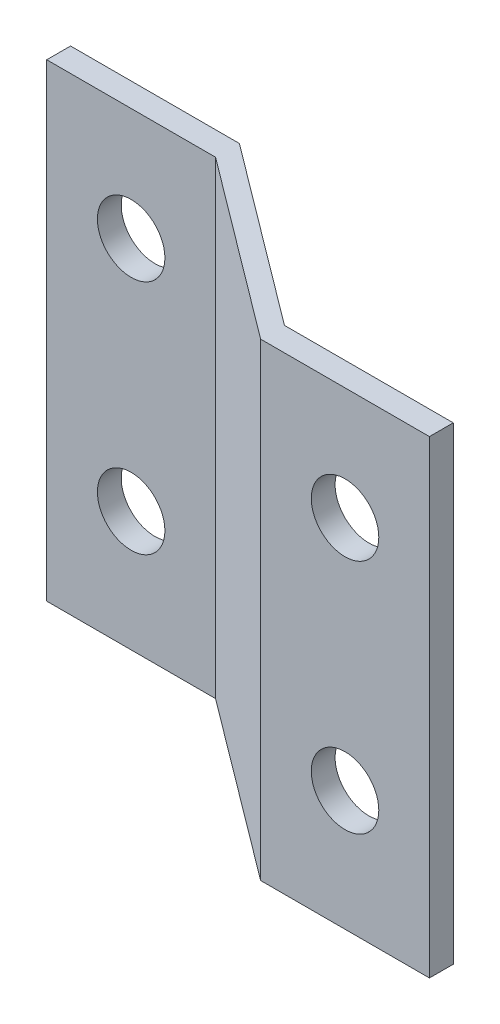
ISO-10303-21;
HEADER;
FILE_DESCRIPTION(('STEP AP214'),'2;1');
FILE_NAME('part.step','',(''),(''),'','','');
FILE_SCHEMA(('AUTOMOTIVE_DESIGN { 1 0 10303 214 1 1 1 1 }'));
ENDSEC;
DATA;
#1=APPLICATION_CONTEXT('core data for automotive mechanical design processes');
#2=APPLICATION_PROTOCOL_DEFINITION('international standard','automotive_design',2000,#1);
#3=PRODUCT_CONTEXT('',#1,'mechanical');
#4=PRODUCT('Part','Part','',(#3));
#5=PRODUCT_RELATED_PRODUCT_CATEGORY('part','',(#4));
#6=PRODUCT_DEFINITION_FORMATION('','',#4);
#7=PRODUCT_DEFINITION_CONTEXT('part definition',#1,'design');
#8=PRODUCT_DEFINITION('design','',#6,#7);
#9=PRODUCT_DEFINITION_SHAPE('','',#8);
#10=(LENGTH_UNIT() NAMED_UNIT(*) SI_UNIT(.MILLI.,.METRE.));
#11=(NAMED_UNIT(*) PLANE_ANGLE_UNIT() SI_UNIT($,.RADIAN.));
#12=(NAMED_UNIT(*) SI_UNIT($,.STERADIAN.) SOLID_ANGLE_UNIT());
#13=UNCERTAINTY_MEASURE_WITH_UNIT(LENGTH_MEASURE(1.E-05),#10,'distance_accuracy_value','');
#14=(GEOMETRIC_REPRESENTATION_CONTEXT(3) GLOBAL_UNCERTAINTY_ASSIGNED_CONTEXT((#13)) GLOBAL_UNIT_ASSIGNED_CONTEXT((#10,
#11,#12)) REPRESENTATION_CONTEXT('',''));
#15=CARTESIAN_POINT('',(0.,0.,0.));
#16=DIRECTION('',(0.,0.,1.));
#17=DIRECTION('',(1.,0.,0.));
#18=AXIS2_PLACEMENT_3D('',#15,#16,#17);
#19=CARTESIAN_POINT('',(-33.2847260877516,125.,-35.9879923557688));
#20=DIRECTION('',(0.,0.,1.));
#21=DIRECTION('',(1.,0.,0.));
#22=AXIS2_PLACEMENT_3D('',#19,#20,#21);
#23=PLANE('',#22);
#24=CARTESIAN_POINT('',(-55.7847260877516,95.,-35.9879923557688));
#25=DIRECTION('',(0.,0.,1.));
#26=DIRECTION('',(1.,0.,0.));
#27=AXIS2_PLACEMENT_3D('',#24,#25,#26);
#28=CIRCLE('',#27,9.00000000000002);
#29=CARTESIAN_POINT('',(-46.7847260877516,95.,-35.9879923557688));
#30=VERTEX_POINT('',#29);
#31=EDGE_CURVE('E153',#30,#30,#28,.T.);
#32=ORIENTED_EDGE('',*,*,#31,.T.);
#33=EDGE_LOOP('',(#32));
#34=FACE_BOUND('',#33,.T.);
#35=CARTESIAN_POINT('',(-55.7847260877516,32.,-35.9879923557688));
#36=DIRECTION('',(0.,0.,1.));
#37=DIRECTION('',(1.,0.,0.));
#38=AXIS2_PLACEMENT_3D('',#35,#36,#37);
#39=CIRCLE('',#38,9.);
#40=CARTESIAN_POINT('',(-46.7847260877516,32.,-35.9879923557688));
#41=VERTEX_POINT('',#40);
#42=EDGE_CURVE('E197',#41,#41,#39,.T.);
#43=ORIENTED_EDGE('',*,*,#42,.T.);
#44=EDGE_LOOP('',(#43));
#45=FACE_BOUND('',#44,.T.);
#46=DIRECTION('',(-1.,0.,0.));
#47=VECTOR('',#46,1.);
#48=CARTESIAN_POINT('',(-33.2847260877516,0.,-35.9879923557688));
#49=LINE('',#48,#47);
#50=CARTESIAN_POINT('',(-33.2847260877516,0.,-35.9879923557688));
#51=VERTEX_POINT('',#50);
#52=CARTESIAN_POINT('',(-78.2847260877516,0.,-35.9879923557688));
#53=VERTEX_POINT('',#52);
#54=EDGE_CURVE('E148',#51,#53,#49,.T.);
#55=ORIENTED_EDGE('',*,*,#54,.T.);
#56=DIRECTION('',(0.,-1.,0.));
#57=VECTOR('',#56,1.);
#58=CARTESIAN_POINT('',(-78.2847260877516,125.,-35.9879923557688));
#59=LINE('',#58,#57);
#60=CARTESIAN_POINT('',(-78.2847260877516,125.,-35.9879923557688));
#61=VERTEX_POINT('',#60);
#62=EDGE_CURVE('E11',#61,#53,#59,.T.);
#63=ORIENTED_EDGE('',*,*,#62,.F.);
#64=DIRECTION('',(-1.,0.,0.));
#65=VECTOR('',#64,1.);
#66=CARTESIAN_POINT('',(-33.2847260877516,125.,-35.9879923557688));
#67=LINE('',#66,#65);
#68=CARTESIAN_POINT('',(-33.2847260877516,125.,-35.9879923557688));
#69=VERTEX_POINT('',#68);
#70=EDGE_CURVE('E171',#69,#61,#67,.T.);
#71=ORIENTED_EDGE('',*,*,#70,.F.);
#72=DIRECTION('',(0.,-1.,0.));
#73=VECTOR('',#72,1.);
#74=CARTESIAN_POINT('',(-33.2847260877516,125.,-35.9879923557688));
#75=LINE('',#74,#73);
#76=EDGE_CURVE('E144',#69,#51,#75,.T.);
#77=ORIENTED_EDGE('',*,*,#76,.T.);
#78=EDGE_LOOP('',(#55,#63,#71,#77));
#79=FACE_BOUND('',#78,.T.);
#80=ADVANCED_FACE('F45',(#34,#45,#79),#23,.F.);
#81=CARTESIAN_POINT('',(-78.2847260877516,125.,-35.9879923557688));
#82=DIRECTION('',(1.,0.,0.));
#83=DIRECTION('',(0.,0.,-1.));
#84=AXIS2_PLACEMENT_3D('',#81,#82,#83);
#85=PLANE('',#84);
#86=DIRECTION('',(0.,0.,1.));
#87=VECTOR('',#86,1.);
#88=CARTESIAN_POINT('',(-78.2847260877516,0.,-35.9879923557688));
#89=LINE('',#88,#87);
#90=CARTESIAN_POINT('',(-78.2847260877516,0.,-29.6379923557688));
#91=VERTEX_POINT('',#90);
#92=EDGE_CURVE('E152',#53,#91,#89,.T.);
#93=ORIENTED_EDGE('',*,*,#92,.T.);
#94=DIRECTION('',(0.,-1.,0.));
#95=VECTOR('',#94,1.);
#96=CARTESIAN_POINT('',(-78.2847260877516,125.,-29.6379923557688));
#97=LINE('',#96,#95);
#98=CARTESIAN_POINT('',(-78.2847260877516,125.,-29.6379923557688));
#99=VERTEX_POINT('',#98);
#100=EDGE_CURVE('E55',#99,#91,#97,.T.);
#101=ORIENTED_EDGE('',*,*,#100,.F.);
#102=DIRECTION('',(0.,0.,1.));
#103=VECTOR('',#102,1.);
#104=CARTESIAN_POINT('',(-78.2847260877516,125.,-35.9879923557688));
#105=LINE('',#104,#103);
#106=EDGE_CURVE('E107',#61,#99,#105,.T.);
#107=ORIENTED_EDGE('',*,*,#106,.F.);
#108=ORIENTED_EDGE('',*,*,#62,.T.);
#109=EDGE_LOOP('',(#93,#101,#107,#108));
#110=FACE_BOUND('',#109,.T.);
#111=ADVANCED_FACE('F261',(#110),#85,.F.);
#112=CARTESIAN_POINT('',(-78.2847260877516,125.,-29.6379923557688));
#113=DIRECTION('',(0.,0.,-1.));
#114=DIRECTION('',(-1.,0.,0.));
#115=AXIS2_PLACEMENT_3D('',#112,#113,#114);
#116=PLANE('',#115);
#117=CARTESIAN_POINT('',(-55.7847260877516,95.,-29.6379923557688));
#118=DIRECTION('',(0.,0.,1.));
#119=DIRECTION('',(1.,0.,0.));
#120=AXIS2_PLACEMENT_3D('',#117,#118,#119);
#121=CIRCLE('',#120,9.00000000000002);
#122=CARTESIAN_POINT('',(-46.7847260877516,95.,-29.6379923557688));
#123=VERTEX_POINT('',#122);
#124=EDGE_CURVE('E210',#123,#123,#121,.T.);
#125=ORIENTED_EDGE('',*,*,#124,.F.);
#126=EDGE_LOOP('',(#125));
#127=FACE_BOUND('',#126,.T.);
#128=CARTESIAN_POINT('',(-55.7847260877516,32.,-29.6379923557688));
#129=DIRECTION('',(0.,0.,1.));
#130=DIRECTION('',(1.,0.,0.));
#131=AXIS2_PLACEMENT_3D('',#128,#129,#130);
#132=CIRCLE('',#131,9.);
#133=CARTESIAN_POINT('',(-46.7847260877516,32.,-29.6379923557688));
#134=VERTEX_POINT('',#133);
#135=EDGE_CURVE('E214',#134,#134,#132,.T.);
#136=ORIENTED_EDGE('',*,*,#135,.F.);
#137=EDGE_LOOP('',(#136));
#138=FACE_BOUND('',#137,.T.);
#139=DIRECTION('',(1.,0.,0.));
#140=VECTOR('',#139,1.);
#141=CARTESIAN_POINT('',(-78.2847260877516,0.,-29.6379923557688));
#142=LINE('',#141,#140);
#143=CARTESIAN_POINT('',(-33.2847260877516,0.,-29.6379923557688));
#144=VERTEX_POINT('',#143);
#145=EDGE_CURVE('E156',#91,#144,#142,.T.);
#146=ORIENTED_EDGE('',*,*,#145,.T.);
#147=DIRECTION('',(0.,-1.,0.));
#148=VECTOR('',#147,1.);
#149=CARTESIAN_POINT('',(-33.2847260877516,125.,-29.6379923557688));
#150=LINE('',#149,#148);
#151=CARTESIAN_POINT('',(-33.2847260877516,125.,-29.6379923557688));
#152=VERTEX_POINT('',#151);
#153=EDGE_CURVE('E182',#152,#144,#150,.T.);
#154=ORIENTED_EDGE('',*,*,#153,.F.);
#155=DIRECTION('',(1.,0.,0.));
#156=VECTOR('',#155,1.);
#157=CARTESIAN_POINT('',(-78.2847260877516,125.,-29.6379923557688));
#158=LINE('',#157,#156);
#159=EDGE_CURVE('E225',#99,#152,#158,.T.);
#160=ORIENTED_EDGE('',*,*,#159,.F.);
#161=ORIENTED_EDGE('',*,*,#100,.T.);
#162=EDGE_LOOP('',(#146,#154,#160,#161));
#163=FACE_BOUND('',#162,.T.);
#164=ADVANCED_FACE('F268',(#127,#138,#163),#116,.F.);
#165=CARTESIAN_POINT('',(-33.2847260877516,125.,-29.6379923557688));
#166=DIRECTION('',(0.599799872596146,0.,-0.800150056447943));
#167=DIRECTION('',(-0.800150056447943,0.,-0.599799872596146));
#168=AXIS2_PLACEMENT_3D('',#165,#166,#167);
#169=PLANE('',#168);
#170=DIRECTION('',(0.800150056447943,0.,0.599799872596146));
#171=VECTOR('',#170,1.);
#172=CARTESIAN_POINT('',(-33.2847260877516,0.,-29.6379923557688));
#173=LINE('',#172,#171);
#174=CARTESIAN_POINT('',(14.724277299125,0.,6.34999999999998));
#175=VERTEX_POINT('',#174);
#176=EDGE_CURVE('E159',#144,#175,#173,.T.);
#177=ORIENTED_EDGE('',*,*,#176,.T.);
#178=DIRECTION('',(0.,-1.,0.));
#179=VECTOR('',#178,1.);
#180=CARTESIAN_POINT('',(14.724277299125,125.,6.34999999999998));
#181=LINE('',#180,#179);
#182=CARTESIAN_POINT('',(14.724277299125,125.,6.34999999999998));
#183=VERTEX_POINT('',#182);
#184=EDGE_CURVE('E178',#183,#175,#181,.T.);
#185=ORIENTED_EDGE('',*,*,#184,.F.);
#186=DIRECTION('',(0.800150056447943,0.,0.599799872596146));
#187=VECTOR('',#186,1.);
#188=CARTESIAN_POINT('',(-33.2847260877516,125.,-29.6379923557688));
#189=LINE('',#188,#187);
#190=EDGE_CURVE('E228',#152,#183,#189,.T.);
#191=ORIENTED_EDGE('',*,*,#190,.F.);
#192=ORIENTED_EDGE('',*,*,#153,.T.);
#193=EDGE_LOOP('',(#177,#185,#191,#192));
#194=FACE_BOUND('',#193,.T.);
#195=ADVANCED_FACE('F236',(#194),#169,.F.);
#196=CARTESIAN_POINT('',(14.724277299125,125.,6.34999999999998));
#197=DIRECTION('',(0.,0.,-1.));
#198=DIRECTION('',(-1.,0.,0.));
#199=AXIS2_PLACEMENT_3D('',#196,#197,#198);
#200=PLANE('',#199);
#201=CARTESIAN_POINT('',(37.224277299125,95.,6.34999999999999));
#202=DIRECTION('',(0.,0.,1.));
#203=DIRECTION('',(1.,0.,0.));
#204=AXIS2_PLACEMENT_3D('',#201,#202,#203);
#205=CIRCLE('',#204,9.00000000000001);
#206=CARTESIAN_POINT('',(46.224277299125,95.,6.34999999999999));
#207=VERTEX_POINT('',#206);
#208=EDGE_CURVE('E191',#207,#207,#205,.T.);
#209=ORIENTED_EDGE('',*,*,#208,.F.);
#210=EDGE_LOOP('',(#209));
#211=FACE_BOUND('',#210,.T.);
#212=CARTESIAN_POINT('',(37.224277299125,32.,6.34999999999999));
#213=DIRECTION('',(0.,0.,1.));
#214=DIRECTION('',(1.,0.,0.));
#215=AXIS2_PLACEMENT_3D('',#212,#213,#214);
#216=CIRCLE('',#215,9.);
#217=CARTESIAN_POINT('',(46.224277299125,32.,6.34999999999999));
#218=VERTEX_POINT('',#217);
#219=EDGE_CURVE('E199',#218,#218,#216,.T.);
#220=ORIENTED_EDGE('',*,*,#219,.F.);
#221=EDGE_LOOP('',(#220));
#222=FACE_BOUND('',#221,.T.);
#223=DIRECTION('',(1.,0.,0.));
#224=VECTOR('',#223,1.);
#225=CARTESIAN_POINT('',(14.724277299125,0.,6.34999999999998));
#226=LINE('',#225,#224);
#227=CARTESIAN_POINT('',(59.724277299125,0.,6.34999999999998));
#228=VERTEX_POINT('',#227);
#229=EDGE_CURVE('E162',#175,#228,#226,.T.);
#230=ORIENTED_EDGE('',*,*,#229,.T.);
#231=DIRECTION('',(0.,-1.,0.));
#232=VECTOR('',#231,1.);
#233=CARTESIAN_POINT('',(59.724277299125,125.,6.34999999999998));
#234=LINE('',#233,#232);
#235=CARTESIAN_POINT('',(59.724277299125,125.,6.34999999999998));
#236=VERTEX_POINT('',#235);
#237=EDGE_CURVE('E137',#236,#228,#234,.T.);
#238=ORIENTED_EDGE('',*,*,#237,.F.);
#239=DIRECTION('',(1.,0.,0.));
#240=VECTOR('',#239,1.);
#241=CARTESIAN_POINT('',(14.724277299125,125.,6.34999999999998));
#242=LINE('',#241,#240);
#243=EDGE_CURVE('E126',#183,#236,#242,.T.);
#244=ORIENTED_EDGE('',*,*,#243,.F.);
#245=ORIENTED_EDGE('',*,*,#184,.T.);
#246=EDGE_LOOP('',(#230,#238,#244,#245));
#247=FACE_BOUND('',#246,.T.);
#248=ADVANCED_FACE('F240',(#211,#222,#247),#200,.F.);
#249=CARTESIAN_POINT('',(59.724277299125,125.,6.34999999999998));
#250=DIRECTION('',(-1.,0.,0.));
#251=DIRECTION('',(0.,0.,1.));
#252=AXIS2_PLACEMENT_3D('',#249,#250,#251);
#253=PLANE('',#252);
#254=DIRECTION('',(0.,0.,-1.));
#255=VECTOR('',#254,1.);
#256=CARTESIAN_POINT('',(59.724277299125,0.,6.34999999999998));
#257=LINE('',#256,#255);
#258=CARTESIAN_POINT('',(59.724277299125,0.,0.));
#259=VERTEX_POINT('',#258);
#260=EDGE_CURVE('E135',#228,#259,#257,.T.);
#261=ORIENTED_EDGE('',*,*,#260,.T.);
#262=DIRECTION('',(0.,-1.,0.));
#263=VECTOR('',#262,1.);
#264=CARTESIAN_POINT('',(59.724277299125,125.,0.));
#265=LINE('',#264,#263);
#266=CARTESIAN_POINT('',(59.724277299125,125.,0.));
#267=VERTEX_POINT('',#266);
#268=EDGE_CURVE('E132',#267,#259,#265,.T.);
#269=ORIENTED_EDGE('',*,*,#268,.F.);
#270=DIRECTION('',(0.,0.,-1.));
#271=VECTOR('',#270,1.);
#272=CARTESIAN_POINT('',(59.724277299125,125.,6.34999999999998));
#273=LINE('',#272,#271);
#274=EDGE_CURVE('E120',#236,#267,#273,.T.);
#275=ORIENTED_EDGE('',*,*,#274,.F.);
#276=ORIENTED_EDGE('',*,*,#237,.T.);
#277=EDGE_LOOP('',(#261,#269,#275,#276));
#278=FACE_BOUND('',#277,.T.);
#279=ADVANCED_FACE('F133',(#278),#253,.F.);
#280=CARTESIAN_POINT('',(59.724277299125,125.,0.));
#281=DIRECTION('',(0.,0.,1.));
#282=DIRECTION('',(1.,0.,0.));
#283=AXIS2_PLACEMENT_3D('',#280,#281,#282);
#284=PLANE('',#283);
#285=CARTESIAN_POINT('',(37.224277299125,95.,0.));
#286=DIRECTION('',(0.,0.,1.));
#287=DIRECTION('',(1.,0.,0.));
#288=AXIS2_PLACEMENT_3D('',#285,#286,#287);
#289=CIRCLE('',#288,9.00000000000001);
#290=CARTESIAN_POINT('',(46.224277299125,95.,0.));
#291=VERTEX_POINT('',#290);
#292=EDGE_CURVE('E48',#291,#291,#289,.T.);
#293=ORIENTED_EDGE('',*,*,#292,.T.);
#294=EDGE_LOOP('',(#293));
#295=FACE_BOUND('',#294,.T.);
#296=CARTESIAN_POINT('',(37.224277299125,32.,0.));
#297=DIRECTION('',(0.,0.,1.));
#298=DIRECTION('',(1.,0.,0.));
#299=AXIS2_PLACEMENT_3D('',#296,#297,#298);
#300=CIRCLE('',#299,9.);
#301=CARTESIAN_POINT('',(46.224277299125,32.,0.));
#302=VERTEX_POINT('',#301);
#303=EDGE_CURVE('E188',#302,#302,#300,.T.);
#304=ORIENTED_EDGE('',*,*,#303,.T.);
#305=EDGE_LOOP('',(#304));
#306=FACE_BOUND('',#305,.T.);
#307=DIRECTION('',(-1.,0.,0.));
#308=VECTOR('',#307,1.);
#309=CARTESIAN_POINT('',(59.724277299125,0.,0.));
#310=LINE('',#309,#308);
#311=CARTESIAN_POINT('',(14.724277299125,0.,0.));
#312=VERTEX_POINT('',#311);
#313=EDGE_CURVE('E93',#259,#312,#310,.T.);
#314=ORIENTED_EDGE('',*,*,#313,.T.);
#315=DIRECTION('',(0.,-1.,0.));
#316=VECTOR('',#315,1.);
#317=CARTESIAN_POINT('',(14.724277299125,125.,0.));
#318=LINE('',#317,#316);
#319=CARTESIAN_POINT('',(14.724277299125,125.,0.));
#320=VERTEX_POINT('',#319);
#321=EDGE_CURVE('E138',#320,#312,#318,.T.);
#322=ORIENTED_EDGE('',*,*,#321,.F.);
#323=DIRECTION('',(-1.,0.,0.));
#324=VECTOR('',#323,1.);
#325=CARTESIAN_POINT('',(59.724277299125,125.,0.));
#326=LINE('',#325,#324);
#327=EDGE_CURVE('E124',#267,#320,#326,.T.);
#328=ORIENTED_EDGE('',*,*,#327,.F.);
#329=ORIENTED_EDGE('',*,*,#268,.T.);
#330=EDGE_LOOP('',(#314,#322,#328,#329));
#331=FACE_BOUND('',#330,.T.);
#332=ADVANCED_FACE('F140',(#295,#306,#331),#284,.F.);
#333=CARTESIAN_POINT('',(14.724277299125,125.,0.));
#334=DIRECTION('',(-0.599799872596146,0.,0.800150056447943));
#335=DIRECTION('',(0.800150056447943,0.,0.599799872596146));
#336=AXIS2_PLACEMENT_3D('',#333,#334,#335);
#337=PLANE('',#336);
#338=DIRECTION('',(-0.800150056447943,0.,-0.599799872596146));
#339=VECTOR('',#338,1.);
#340=CARTESIAN_POINT('',(14.724277299125,0.,0.));
#341=LINE('',#340,#339);
#342=EDGE_CURVE('E99',#312,#51,#341,.T.);
#343=ORIENTED_EDGE('',*,*,#342,.T.);
#344=ORIENTED_EDGE('',*,*,#76,.F.);
#345=DIRECTION('',(-0.800150056447943,0.,-0.599799872596146));
#346=VECTOR('',#345,1.);
#347=CARTESIAN_POINT('',(14.724277299125,125.,0.));
#348=LINE('',#347,#346);
#349=EDGE_CURVE('E64',#320,#69,#348,.T.);
#350=ORIENTED_EDGE('',*,*,#349,.F.);
#351=ORIENTED_EDGE('',*,*,#321,.T.);
#352=EDGE_LOOP('',(#343,#344,#350,#351));
#353=FACE_BOUND('',#352,.T.);
#354=ADVANCED_FACE('F248',(#353),#337,.F.);
#355=CARTESIAN_POINT('',(0.,125.,0.));
#356=DIRECTION('',(0.,1.,0.));
#357=DIRECTION('',(0.,0.,1.));
#358=AXIS2_PLACEMENT_3D('',#355,#356,#357);
#359=PLANE('',#358);
#360=ORIENTED_EDGE('',*,*,#70,.T.);
#361=ORIENTED_EDGE('',*,*,#106,.T.);
#362=ORIENTED_EDGE('',*,*,#159,.T.);
#363=ORIENTED_EDGE('',*,*,#190,.T.);
#364=ORIENTED_EDGE('',*,*,#243,.T.);
#365=ORIENTED_EDGE('',*,*,#274,.T.);
#366=ORIENTED_EDGE('',*,*,#327,.T.);
#367=ORIENTED_EDGE('',*,*,#349,.T.);
#368=EDGE_LOOP('',(#360,#361,#362,#363,#364,#365,#366,#367));
#369=FACE_BOUND('',#368,.T.);
#370=ADVANCED_FACE('F122',(#369),#359,.T.);
#371=CARTESIAN_POINT('',(0.,0.,0.));
#372=DIRECTION('',(0.,1.,0.));
#373=DIRECTION('',(0.,0.,1.));
#374=AXIS2_PLACEMENT_3D('',#371,#372,#373);
#375=PLANE('',#374);
#376=ORIENTED_EDGE('',*,*,#54,.F.);
#377=ORIENTED_EDGE('',*,*,#342,.F.);
#378=ORIENTED_EDGE('',*,*,#313,.F.);
#379=ORIENTED_EDGE('',*,*,#260,.F.);
#380=ORIENTED_EDGE('',*,*,#229,.F.);
#381=ORIENTED_EDGE('',*,*,#176,.F.);
#382=ORIENTED_EDGE('',*,*,#145,.F.);
#383=ORIENTED_EDGE('',*,*,#92,.F.);
#384=EDGE_LOOP('',(#376,#377,#378,#379,#380,#381,#382,#383));
#385=FACE_BOUND('',#384,.T.);
#386=ADVANCED_FACE('F243',(#385),#375,.F.);
#387=CARTESIAN_POINT('',(-55.7847260877516,32.,-35.9879923557688));
#388=DIRECTION('',(0.,0.,1.));
#389=DIRECTION('',(1.,0.,0.));
#390=AXIS2_PLACEMENT_3D('',#387,#388,#389);
#391=CYLINDRICAL_SURFACE('',#390,9.);
#392=ORIENTED_EDGE('',*,*,#42,.F.);
#393=EDGE_LOOP('',(#392));
#394=FACE_BOUND('',#393,.T.);
#395=ORIENTED_EDGE('',*,*,#135,.T.);
#396=EDGE_LOOP('',(#395));
#397=FACE_BOUND('',#396,.T.);
#398=ADVANCED_FACE('F273',(#394,#397),#391,.F.);
#399=CARTESIAN_POINT('',(-55.7847260877516,95.,-35.9879923557688));
#400=DIRECTION('',(0.,0.,1.));
#401=DIRECTION('',(1.,0.,0.));
#402=AXIS2_PLACEMENT_3D('',#399,#400,#401);
#403=CYLINDRICAL_SURFACE('',#402,9.00000000000002);
#404=ORIENTED_EDGE('',*,*,#31,.F.);
#405=EDGE_LOOP('',(#404));
#406=FACE_BOUND('',#405,.T.);
#407=ORIENTED_EDGE('',*,*,#124,.T.);
#408=EDGE_LOOP('',(#407));
#409=FACE_BOUND('',#408,.T.);
#410=ADVANCED_FACE('F276',(#406,#409),#403,.F.);
#411=CARTESIAN_POINT('',(37.224277299125,32.,-35.9879923557688));
#412=DIRECTION('',(0.,0.,1.));
#413=DIRECTION('',(1.,0.,0.));
#414=AXIS2_PLACEMENT_3D('',#411,#412,#413);
#415=CYLINDRICAL_SURFACE('',#414,9.);
#416=ORIENTED_EDGE('',*,*,#219,.T.);
#417=EDGE_LOOP('',(#416));
#418=FACE_BOUND('',#417,.T.);
#419=ORIENTED_EDGE('',*,*,#303,.F.);
#420=EDGE_LOOP('',(#419));
#421=FACE_BOUND('',#420,.T.);
#422=ADVANCED_FACE('F351',(#418,#421),#415,.F.);
#423=CARTESIAN_POINT('',(37.224277299125,95.,-35.9879923557688));
#424=DIRECTION('',(0.,0.,1.));
#425=DIRECTION('',(1.,0.,0.));
#426=AXIS2_PLACEMENT_3D('',#423,#424,#425);
#427=CYLINDRICAL_SURFACE('',#426,9.00000000000001);
#428=ORIENTED_EDGE('',*,*,#208,.T.);
#429=EDGE_LOOP('',(#428));
#430=FACE_BOUND('',#429,.T.);
#431=ORIENTED_EDGE('',*,*,#292,.F.);
#432=EDGE_LOOP('',(#431));
#433=FACE_BOUND('',#432,.T.);
#434=ADVANCED_FACE('F360',(#430,#433),#427,.F.);
#435=CLOSED_SHELL('',(#80,#111,#164,#195,#248,#279,#332,#354,#370,#386,#398,#410,#422,#434));
#436=MANIFOLD_SOLID_BREP('B2',#435);
#437=ADVANCED_BREP_SHAPE_REPRESENTATION('',(#18,#436),#14);
#438=SHAPE_DEFINITION_REPRESENTATION(#9,#437);
ENDSEC;
END-ISO-10303-21;
